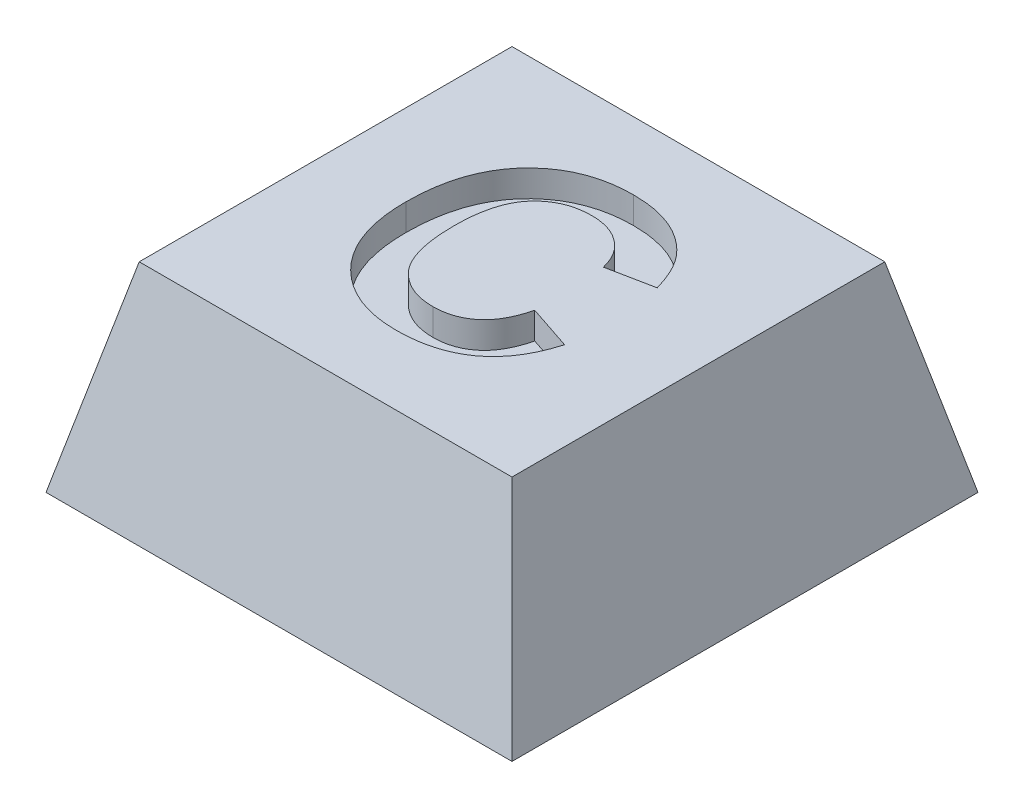
ISO-10303-21;
HEADER;
FILE_DESCRIPTION(('STEP AP214'),'2;1');
FILE_NAME('part.step','',(''),(''),'','','');
FILE_SCHEMA(('AUTOMOTIVE_DESIGN { 1 0 10303 214 1 1 1 1 }'));
ENDSEC;
DATA;
#1=APPLICATION_CONTEXT('core data for automotive mechanical design processes');
#2=APPLICATION_PROTOCOL_DEFINITION('international standard','automotive_design',2000,#1);
#3=PRODUCT_CONTEXT('',#1,'mechanical');
#4=PRODUCT('Part','Part','',(#3));
#5=PRODUCT_RELATED_PRODUCT_CATEGORY('part','',(#4));
#6=PRODUCT_DEFINITION_FORMATION('','',#4);
#7=PRODUCT_DEFINITION_CONTEXT('part definition',#1,'design');
#8=PRODUCT_DEFINITION('design','',#6,#7);
#9=PRODUCT_DEFINITION_SHAPE('','',#8);
#10=(LENGTH_UNIT() NAMED_UNIT(*) SI_UNIT(.MILLI.,.METRE.));
#11=(NAMED_UNIT(*) PLANE_ANGLE_UNIT() SI_UNIT($,.RADIAN.));
#12=(NAMED_UNIT(*) SI_UNIT($,.STERADIAN.) SOLID_ANGLE_UNIT());
#13=UNCERTAINTY_MEASURE_WITH_UNIT(LENGTH_MEASURE(1.E-05),#10,'distance_accuracy_value','');
#14=(GEOMETRIC_REPRESENTATION_CONTEXT(3) GLOBAL_UNCERTAINTY_ASSIGNED_CONTEXT((#13)) GLOBAL_UNIT_ASSIGNED_CONTEXT((#10,
#11,#12)) REPRESENTATION_CONTEXT('',''));
#15=CARTESIAN_POINT('',(0.,0.,0.));
#16=DIRECTION('',(0.,0.,1.));
#17=DIRECTION('',(1.,0.,0.));
#18=AXIS2_PLACEMENT_3D('',#15,#16,#17);
#19=CARTESIAN_POINT('',(0.,3.,0.));
#20=DIRECTION('',(0.,-1.,0.));
#21=DIRECTION('',(0.,0.,-1.));
#22=AXIS2_PLACEMENT_3D('',#19,#20,#21);
#23=PLANE('',#22);
#24=DIRECTION('',(-1.,0.,0.));
#25=VECTOR('',#24,1.);
#26=CARTESIAN_POINT('',(11.,3.,-0.7));
#27=LINE('',#26,#25);
#28=CARTESIAN_POINT('',(6.3,3.,-0.7));
#29=VERTEX_POINT('',#28);
#30=CARTESIAN_POINT('',(0.7,3.,-0.7));
#31=VERTEX_POINT('',#30);
#32=EDGE_CURVE('E65',#29,#31,#27,.T.);
#33=ORIENTED_EDGE('',*,*,#32,.F.);
#34=DIRECTION('',(0.,0.,1.));
#35=VECTOR('',#34,1.);
#36=CARTESIAN_POINT('',(6.3,3.,-7.));
#37=LINE('',#36,#35);
#38=CARTESIAN_POINT('',(6.3,3.,-6.3));
#39=VERTEX_POINT('',#38);
#40=EDGE_CURVE('E200',#39,#29,#37,.T.);
#41=ORIENTED_EDGE('',*,*,#40,.F.);
#42=DIRECTION('',(-1.,0.,0.));
#43=VECTOR('',#42,1.);
#44=CARTESIAN_POINT('',(11.,3.,-6.3));
#45=LINE('',#44,#43);
#46=CARTESIAN_POINT('',(0.699999999999998,3.,-6.3));
#47=VERTEX_POINT('',#46);
#48=EDGE_CURVE('E187',#39,#47,#45,.T.);
#49=ORIENTED_EDGE('',*,*,#48,.T.);
#50=DIRECTION('',(0.,0.,1.));
#51=VECTOR('',#50,1.);
#52=CARTESIAN_POINT('',(0.7,3.,-7.));
#53=LINE('',#52,#51);
#54=EDGE_CURVE('E201',#47,#31,#53,.T.);
#55=ORIENTED_EDGE('',*,*,#54,.T.);
#56=EDGE_LOOP('',(#33,#41,#49,#55));
#57=FACE_BOUND('',#56,.T.);
#58=CARTESIAN_POINT('',(3.49202919417469,3.,-2.32237478200368));
#59=CARTESIAN_POINT('',(3.51611680894592,3.,-2.32297572990987));
#60=CARTESIAN_POINT('',(3.56348152728715,3.,-2.32415740474918));
#61=CARTESIAN_POINT('',(3.63349023270817,3.,-2.33165740459681));
#62=CARTESIAN_POINT('',(3.7006843119823,3.,-2.34597007319835));
#63=CARTESIAN_POINT('',(3.7653926590744,3.,-2.36489598698485));
#64=CARTESIAN_POINT('',(3.82786668660298,3.,-2.38864242551098));
#65=CARTESIAN_POINT('',(3.88715346146772,3.,-2.41910433113053));
#66=CARTESIAN_POINT('',(3.94441942454572,3.,-2.45411576773062));
#67=CARTESIAN_POINT('',(3.99847635289725,3.,-2.49514648860273));
#68=CARTESIAN_POINT('',(4.05004809618444,3.,-2.54121130678809));
#69=CARTESIAN_POINT('',(4.09708458635847,3.,-2.59445075600599));
#70=CARTESIAN_POINT('',(4.14071483571103,3.,-2.65358561276894));
#71=CARTESIAN_POINT('',(4.1803853292997,3.,-2.71901107643952));
#72=CARTESIAN_POINT('',(4.21742158412729,3.,-2.79016712882709));
#73=CARTESIAN_POINT('',(4.24893221835754,3.,-2.86816241928443));
#74=CARTESIAN_POINT('',(4.2782871984308,3.,-2.95173650754942));
#75=CARTESIAN_POINT('',(4.29337860671829,3.,-3.01027874118026));
#76=CARTESIAN_POINT('',(4.30112374545674,3.,-3.0403234999524));
#77=B_SPLINE_CURVE_WITH_KNOTS('',3,(#58,#59,#60,#61,#62,#63,#64,#65,#66,#67,#68,#69,#70,#71,#72,
#73,#74,#75,#76),.UNSPECIFIED.,.F.,.F.,(4,1,1,1,1,1,1,1,1,1,1,1,1,1,1,1,4),(0.,
0.061261111030951,0.120460879867491,0.178740622720622,0.235724110774077,0.291792154435533,
0.348405626021554,0.404978529009326,0.462271107462339,0.520759570899294,0.580529380750155,
0.642578218137747,0.707405435716592,0.77492030077632,0.846330275241362,0.921134375567754,1.),.UNSPECIFIED.);
#78=CARTESIAN_POINT('',(3.49202919417469,3.,-2.32237478200368));
#79=VERTEX_POINT('',#78);
#80=CARTESIAN_POINT('',(4.30112374545674,3.,-3.0403234999524));
#81=VERTEX_POINT('',#80);
#82=EDGE_CURVE('E58',#79,#81,#77,.T.);
#83=ORIENTED_EDGE('',*,*,#82,.T.);
#84=DIRECTION('',(0.948683298050514,0.,0.316227766016838));
#85=VECTOR('',#84,1.);
#86=CARTESIAN_POINT('',(4.30112374545674,3.,-3.0403234999524));
#87=LINE('',#86,#85);
#88=CARTESIAN_POINT('',(4.97420066853367,3.,-2.81596452559342));
#89=VERTEX_POINT('',#88);
#90=EDGE_CURVE('E171',#81,#89,#87,.T.);
#91=ORIENTED_EDGE('',*,*,#90,.T.);
#92=CARTESIAN_POINT('',(4.97420066853367,3.,-2.81596452559342));
#93=CARTESIAN_POINT('',(4.96052167379467,3.,-2.77183256725306));
#94=CARTESIAN_POINT('',(4.93373389902689,3.,-2.68540831001492));
#95=CARTESIAN_POINT('',(4.88454705366547,3.,-2.56154182823337));
#96=CARTESIAN_POINT('',(4.82830265897915,3.,-2.44674911241438));
#97=CARTESIAN_POINT('',(4.76702338748191,3.,-2.33968659004377));
#98=CARTESIAN_POINT('',(4.69689840259219,3.,-2.24312003297682));
#99=CARTESIAN_POINT('',(4.62185367309214,3.,-2.15385218027148));
#100=CARTESIAN_POINT('',(4.53965781979006,3.,-2.07376318319285));
#101=CARTESIAN_POINT('',(4.45071641969911,3.,-2.00268202255746));
#102=CARTESIAN_POINT('',(4.35588558365264,3.,-1.93982340550905));
#103=CARTESIAN_POINT('',(4.25406375018434,3.,-1.88668332919111));
#104=CARTESIAN_POINT('',(4.14677046620917,3.,-1.84091515842684));
#105=CARTESIAN_POINT('',(4.03291771716647,3.,-1.80383329066162));
#106=CARTESIAN_POINT('',(3.91326110657738,3.,-1.77413634320027));
#107=CARTESIAN_POINT('',(3.78723919763197,3.,-1.75452134804609));
#108=CARTESIAN_POINT('',(3.6554415079085,3.,-1.74122173335712));
#109=CARTESIAN_POINT('',(3.56544815168326,3.,-1.73977973139058));
#110=CARTESIAN_POINT('',(3.51937294417469,3.,-1.73904144867035));
#111=B_SPLINE_CURVE_WITH_KNOTS('',3,(#92,#93,#94,#95,#96,#97,#98,#99,#100,#101,#102,#103,#104,
#105,#106,#107,#108,#109,#110),.UNSPECIFIED.,.F.,.F.,(4,1,1,1,1,1,1,1,1,1,1,1,1,1,1,1,4),(0.,
0.0704150419531534,0.137894802951166,0.202902915889941,0.265167571851971,0.325674736113894,
0.384566100128023,0.442763707684589,0.500294498194352,0.557901351941778,0.615910003955178,
0.675133413252053,0.735519841283144,0.798251590252311,0.8628542859845,0.929783514058984,1.),.UNSPECIFIED.);
#112=CARTESIAN_POINT('',(3.51937294417469,3.,-1.73904144867035));
#113=VERTEX_POINT('',#112);
#114=EDGE_CURVE('E566',#89,#113,#111,.T.);
#115=ORIENTED_EDGE('',*,*,#114,.T.);
#116=CARTESIAN_POINT('',(3.51937294417469,3.,-1.73904144867035));
#117=CARTESIAN_POINT('',(3.46250251547439,3.,-1.74021740578187));
#118=CARTESIAN_POINT('',(3.35063668164565,3.,-1.74253054858446));
#119=CARTESIAN_POINT('',(3.18704349515312,3.,-1.76581552485004));
#120=CARTESIAN_POINT('',(3.03114658558933,3.,-1.80214564045639));
#121=CARTESIAN_POINT('',(2.88272293242752,3.,-1.85244405346918));
#122=CARTESIAN_POINT('',(2.74276324276726,3.,-1.91906417379479));
#123=CARTESIAN_POINT('',(2.60999060760055,3.,-1.99926616204049));
#124=CARTESIAN_POINT('',(2.48537129811509,3.,-2.09467824861767));
#125=CARTESIAN_POINT('',(2.36934249963198,3.,-2.20369237218259));
#126=CARTESIAN_POINT('',(2.26392753085181,3.,-2.32547632822594));
#127=CARTESIAN_POINT('',(2.17277085363422,3.,-2.45937203113081));
#128=CARTESIAN_POINT('',(2.0948806251045,3.,-2.60349321521211));
#129=CARTESIAN_POINT('',(2.03192572641803,3.,-2.75852706760747));
#130=CARTESIAN_POINT('',(1.98269924385597,3.,-2.92431439526389));
#131=CARTESIAN_POINT('',(1.94821599072518,3.,-3.1006259707557));
#132=CARTESIAN_POINT('',(1.92663856366421,3.,-3.28751733236473));
#133=CARTESIAN_POINT('',(1.92418026441356,3.,-3.41559642067566));
#134=CARTESIAN_POINT('',(1.92291861725162,3.,-3.48132910892676));
#135=B_SPLINE_CURVE_WITH_KNOTS('',3,(#116,#117,#118,#119,#120,#121,#122,#123,#124,#125,#126,
#127,#128,#129,#130,#131,#132,#133,#134),.UNSPECIFIED.,.F.,.F.,(4,1,1,1,1,1,1,1,1,1,1,1,1,1,1,1,
4),(0.,0.0640655694681715,0.12601889087274,0.185824822435675,0.244304364347181,
0.302279210648544,0.36019597760611,0.418835489384929,0.478842389506342,0.539358251400318,
0.600002402667006,0.661054813797786,0.723669356261587,0.788261326541615,0.855679184967412,
0.925931740553533,1.),.UNSPECIFIED.);
#136=CARTESIAN_POINT('',(1.92291861725162,3.,-3.48132910892676));
#137=VERTEX_POINT('',#136);
#138=EDGE_CURVE('E561',#113,#137,#135,.T.);
#139=ORIENTED_EDGE('',*,*,#138,.T.);
#140=CARTESIAN_POINT('',(1.92291861725162,3.,-3.48132910892676));
#141=CARTESIAN_POINT('',(1.92417457762654,3.,-3.55056648538445));
#142=CARTESIAN_POINT('',(1.92662472715422,3.,-3.685635973731));
#143=CARTESIAN_POINT('',(1.94824257682245,3.,-3.88201544605772));
#144=CARTESIAN_POINT('',(1.98180300097432,3.,-4.06709165053107));
#145=CARTESIAN_POINT('',(2.03111268313543,3.,-4.23971704092617));
#146=CARTESIAN_POINT('',(2.09314244987708,3.,-4.40110649515643));
#147=CARTESIAN_POINT('',(2.17112724535143,3.,-4.54965791250847));
#148=CARTESIAN_POINT('',(2.26137463759631,3.,-4.68735188932803));
#149=CARTESIAN_POINT('',(2.36631118224364,3.,-4.81166466423526));
#150=CARTESIAN_POINT('',(2.48286876789756,3.,-4.92203759854897));
#151=CARTESIAN_POINT('',(2.60777463717314,3.,-5.01963711149734));
#152=CARTESIAN_POINT('',(2.74219404974488,3.,-5.10151610526197));
#153=CARTESIAN_POINT('',(2.88539143233108,3.,-5.16847246196603));
#154=CARTESIAN_POINT('',(3.03755883773458,3.,-5.22028658602278));
#155=CARTESIAN_POINT('',(3.19839684202891,3.,-5.25759682223829));
#156=CARTESIAN_POINT('',(3.36803703916994,3.,-5.27931377889491));
#157=CARTESIAN_POINT('',(3.48402088375698,3.,-5.28235911354874));
#158=CARTESIAN_POINT('',(3.54321108520033,3.,-5.28391324354214));
#159=B_SPLINE_CURVE_WITH_KNOTS('',3,(#140,#141,#142,#143,#144,#145,#146,#147,#148,#149,#150,
#151,#152,#153,#154,#155,#156,#157,#158),.UNSPECIFIED.,.F.,.F.,(4,1,1,1,1,1,1,1,1,1,1,1,1,1,1,1,
4),(0.,0.0757905194890958,0.147853474707659,0.216062561283916,0.281513739182418,
0.344147286720871,0.405039848029214,0.464871931062684,0.524079072848527,0.582724996832957,
0.640361728319916,0.697328760762678,0.754684166326505,0.813113060604922,0.873014604238728,
0.935195361196756,1.),.UNSPECIFIED.);
#160=CARTESIAN_POINT('',(3.54321108520033,3.,-5.28391324354214));
#161=VERTEX_POINT('',#160);
#162=EDGE_CURVE('E555',#137,#161,#159,.T.);
#163=ORIENTED_EDGE('',*,*,#162,.T.);
#164=CARTESIAN_POINT('',(3.54321108520033,3.,-5.28391324354214));
#165=CARTESIAN_POINT('',(3.59490417540688,3.,-5.2826107117257));
#166=CARTESIAN_POINT('',(3.69625535798317,3.,-5.28005692476091));
#167=CARTESIAN_POINT('',(3.84467387317335,3.,-5.26270640216942));
#168=CARTESIAN_POINT('',(3.98533309032242,3.,-5.23225739328103));
#169=CARTESIAN_POINT('',(4.11899331821896,3.,-5.19115800227554));
#170=CARTESIAN_POINT('',(4.24489368934686,3.,-5.13691773942573));
#171=CARTESIAN_POINT('',(4.36325975372196,3.,-5.07063669671643));
#172=CARTESIAN_POINT('',(4.47449836414569,3.,-4.99266556909028));
#173=CARTESIAN_POINT('',(4.54152191703653,3.,-4.93176088349919));
#174=CARTESIAN_POINT('',(4.57526236725161,3.,-4.90110074354214));
#175=B_SPLINE_CURVE_WITH_KNOTS('',3,(#164,#165,#166,#167,#168,#169,#170,#171,#172,#173,#174),
.UNSPECIFIED.,.F.,.F.,(4,1,1,1,1,1,1,1,4),(0.,0.137313759544352,0.269221899062523,
0.396222126499405,0.519140291574912,0.640111565704798,0.759624432420136,0.878992092763873,1.),.UNSPECIFIED.);
#176=CARTESIAN_POINT('',(4.57526236725161,3.,-4.90110074354214));
#177=VERTEX_POINT('',#176);
#178=EDGE_CURVE('E545',#161,#177,#175,.T.);
#179=ORIENTED_EDGE('',*,*,#178,.T.);
#180=CARTESIAN_POINT('',(4.57526236725161,3.,-4.90110074354214));
#181=CARTESIAN_POINT('',(4.59481788925671,3.,-4.8815913851209));
#182=CARTESIAN_POINT('',(4.63438827823294,3.,-4.84211440766134));
#183=CARTESIAN_POINT('',(4.68722585412791,3.,-4.7754660839842));
#184=CARTESIAN_POINT('',(4.73732244021412,3.,-4.70371915221836));
#185=CARTESIAN_POINT('',(4.78388290376538,3.,-4.6256497012682));
#186=CARTESIAN_POINT('',(4.82543567252316,3.,-4.54066776004728));
#187=CARTESIAN_POINT('',(4.86398030383741,3.,-4.45007838047809));
#188=CARTESIAN_POINT('',(4.89946689980702,3.,-4.35353237125029));
#189=CARTESIAN_POINT('',(4.91920152793077,3.,-4.28634231417154));
#190=CARTESIAN_POINT('',(4.92932887366187,3.,-4.25186196149086));
#191=B_SPLINE_CURVE_WITH_KNOTS('',3,(#180,#181,#182,#183,#184,#185,#186,#187,#188,#189,#190),
.UNSPECIFIED.,.F.,.F.,(4,1,1,1,1,1,1,1,4),(0.,0.110661610139293,0.223922580885613,
0.340367194498051,0.461366927555407,0.587913320172306,0.719309719765118,0.855956367990685,1.),.UNSPECIFIED.);
#192=CARTESIAN_POINT('',(4.92932887366187,3.,-4.25186196149086));
#193=VERTEX_POINT('',#192);
#194=EDGE_CURVE('E554',#177,#193,#191,.T.);
#195=ORIENTED_EDGE('',*,*,#194,.T.);
#196=DIRECTION('',(-0.98058067569092,0.,0.196116135138183));
#197=VECTOR('',#196,1.);
#198=CARTESIAN_POINT('',(4.92932887366187,3.,-4.25186196149086));
#199=LINE('',#198,#197);
#200=CARTESIAN_POINT('',(4.25625195058495,3.,-4.11724657687547));
#201=VERTEX_POINT('',#200);
#202=EDGE_CURVE('E586',#193,#201,#199,.T.);
#203=ORIENTED_EDGE('',*,*,#202,.T.);
#204=CARTESIAN_POINT('',(4.25625195058495,3.,-4.11724657687547));
#205=CARTESIAN_POINT('',(4.25053107342916,3.,-4.13932353897863));
#206=CARTESIAN_POINT('',(4.23926244637778,3.,-4.18280936214759));
#207=CARTESIAN_POINT('',(4.21646191291949,3.,-4.24529610194437));
#208=CARTESIAN_POINT('',(4.19030790333489,3.,-4.30459043729654));
#209=CARTESIAN_POINT('',(4.15789240369965,3.,-4.35924004286793));
#210=CARTESIAN_POINT('',(4.12345876092659,3.,-4.41167612567644));
#211=CARTESIAN_POINT('',(4.08269127072711,3.,-4.45957036106955));
#212=CARTESIAN_POINT('',(4.0381934888391,3.,-4.5041779517257));
#213=CARTESIAN_POINT('',(3.98964485982005,3.,-4.54503597940394));
#214=CARTESIAN_POINT('',(3.93762415292998,3.,-4.58131884439474));
#215=CARTESIAN_POINT('',(3.88313295143614,3.,-4.61393488024746));
#216=CARTESIAN_POINT('',(3.82518085531721,3.,-4.64055975710396));
#217=CARTESIAN_POINT('',(3.76453876999298,3.,-4.66209922011643));
#218=CARTESIAN_POINT('',(3.70144822792528,3.,-4.68015843697106));
#219=CARTESIAN_POINT('',(3.63534752992293,3.,-4.69131445679152));
#220=CARTESIAN_POINT('',(3.56680440330837,3.,-4.69987867471469));
#221=CARTESIAN_POINT('',(3.52010354280225,3.,-4.70034273886559));
#222=CARTESIAN_POINT('',(3.49623592494392,3.,-4.70057991020881));
#223=B_SPLINE_CURVE_WITH_KNOTS('',3,(#204,#205,#206,#207,#208,#209,#210,#211,#212,#213,#214,
#215,#216,#217,#218,#219,#220,#221,#222),.UNSPECIFIED.,.F.,.F.,(4,1,1,1,1,1,1,1,1,1,1,1,1,1,1,1,
4),(0.,0.0657016834287565,0.129415078675093,0.191523435490404,0.252186483377304,
0.312349991115616,0.372123768561351,0.433096485607346,0.493819351625764,0.55474739455387,
0.615749876169393,0.676633212199273,0.738216912125845,0.801141922285418,0.865493176101047,
0.931256995323742,1.),.UNSPECIFIED.);
#224=CARTESIAN_POINT('',(3.49623592494392,3.,-4.70057991020881));
#225=VERTEX_POINT('',#224);
#226=EDGE_CURVE('E593',#201,#225,#223,.T.);
#227=ORIENTED_EDGE('',*,*,#226,.T.);
#228=CARTESIAN_POINT('',(3.49623592494392,3.,-4.70057991020881));
#229=CARTESIAN_POINT('',(3.46345817805145,3.,-4.69991794910472));
#230=CARTESIAN_POINT('',(3.39948582403322,3.,-4.69862599910474));
#231=CARTESIAN_POINT('',(3.30598042709671,3.,-4.68422163133387));
#232=CARTESIAN_POINT('',(3.21685915654472,3.,-4.66411884560106));
#233=CARTESIAN_POINT('',(3.13248143292658,3.,-4.63342199574539));
#234=CARTESIAN_POINT('',(3.05336978614843,3.,-4.59416097854338));
#235=CARTESIAN_POINT('',(2.97862510712283,3.,-4.54643482208268));
#236=CARTESIAN_POINT('',(2.90865763474271,3.,-4.49044794874512));
#237=CARTESIAN_POINT('',(2.84344372117106,3.,-4.42553709878164));
#238=CARTESIAN_POINT('',(2.78492309776695,3.,-4.35052865192286));
#239=CARTESIAN_POINT('',(2.73347511661476,3.,-4.26526774257099));
#240=CARTESIAN_POINT('',(2.69079440440862,3.,-4.16878638415222));
#241=CARTESIAN_POINT('',(2.65614445357166,3.,-4.06203136151986));
#242=CARTESIAN_POINT('',(2.62887099480884,3.,-3.94474881100223));
#243=CARTESIAN_POINT('',(2.60939559812234,3.,-3.81678831048973));
#244=CARTESIAN_POINT('',(2.59862511827261,3.,-3.67806232313208));
#245=CARTESIAN_POINT('',(2.59689098050791,3.,-3.5820750386337));
#246=CARTESIAN_POINT('',(2.59599554032854,3.,-3.5325109999524));
#247=B_SPLINE_CURVE_WITH_KNOTS('',3,(#228,#229,#230,#231,#232,#233,#234,#235,#236,#237,#238,
#239,#240,#241,#242,#243,#244,#245,#246),.UNSPECIFIED.,.F.,.F.,(4,1,1,1,1,1,1,1,1,1,1,1,1,1,1,1,
4),(0.,0.0586371378579327,0.114442147410832,0.169048205254452,0.221995273549603,
0.274768432180556,0.326888880850664,0.380476958263482,0.434920839410136,0.491256742374203,
0.550390473800242,0.612762371738895,0.679720015327365,0.751074463246395,0.828128844834478,
0.911252530714446,1.),.UNSPECIFIED.);
#248=CARTESIAN_POINT('',(2.59599554032854,3.,-3.5325109999524));
#249=VERTEX_POINT('',#248);
#250=EDGE_CURVE('E599',#225,#249,#247,.T.);
#251=ORIENTED_EDGE('',*,*,#250,.T.);
#252=CARTESIAN_POINT('',(2.59599554032854,3.,-3.5325109999524));
#253=CARTESIAN_POINT('',(2.5968821633552,3.,-3.47990985233911));
#254=CARTESIAN_POINT('',(2.59859054935794,3.,-3.37855554322628));
#255=CARTESIAN_POINT('',(2.6093587440414,3.,-3.23236132670273));
#256=CARTESIAN_POINT('',(2.62895867696155,3.,-3.09790132268989));
#257=CARTESIAN_POINT('',(2.65586967207876,3.,-2.97493691219596));
#258=CARTESIAN_POINT('',(2.69069423660056,3.,-2.86354341182001));
#259=CARTESIAN_POINT('',(2.73330277130993,3.,-2.76391358663968));
#260=CARTESIAN_POINT('',(2.78395618785242,3.,-2.6759307584889));
#261=CARTESIAN_POINT('',(2.84257567981989,3.,-2.59965351358793));
#262=CARTESIAN_POINT('',(2.90767924627187,3.,-2.53413159547325));
#263=CARTESIAN_POINT('',(2.97750360637937,3.,-2.47779766373055));
#264=CARTESIAN_POINT('',(3.05163681041787,3.,-2.42963237427566));
#265=CARTESIAN_POINT('',(3.13052495908561,3.,-2.39000507963076));
#266=CARTESIAN_POINT('',(3.21446810036846,3.,-2.36002747214086));
#267=CARTESIAN_POINT('',(3.30277634539132,3.,-2.338287185638));
#268=CARTESIAN_POINT('',(3.39577371173474,3.,-2.32446654004919));
#269=CARTESIAN_POINT('',(3.45949434596355,3.,-2.32308180698325));
#270=CARTESIAN_POINT('',(3.49202919417469,3.,-2.32237478200368));
#271=B_SPLINE_CURVE_WITH_KNOTS('',3,(#252,#253,#254,#255,#256,#257,#258,#259,#260,#261,#262,
#263,#264,#265,#266,#267,#268,#269,#270),.UNSPECIFIED.,.F.,.F.,(4,1,1,1,1,1,1,1,1,1,1,1,1,1,1,1,
4),(0.,0.0922005232498242,0.177656206334666,0.256732639089643,0.33017725718312,
0.398062973022245,0.460994882558931,0.519731382248013,0.575527448203976,0.629114465177631,
0.681254031878146,0.732497651874267,0.783792002469296,0.83562331093939,0.888378761586058,
0.943007785580155,1.),.UNSPECIFIED.);
#272=EDGE_CURVE('E167',#249,#79,#271,.T.);
#273=ORIENTED_EDGE('',*,*,#272,.T.);
#274=EDGE_LOOP('',(#83,#91,#115,#139,#163,#179,#195,#203,#227,#251,#273));
#275=FACE_BOUND('',#274,.T.);
#276=ADVANCED_FACE('F42',(#57,#275),#23,.F.);
#277=CARTESIAN_POINT('',(7.,0.,-7.));
#278=DIRECTION('',(-0.973841209741793,-0.227229615606418,0.));
#279=DIRECTION('',(0.227229615606418,-0.973841209741793,0.));
#280=AXIS2_PLACEMENT_3D('',#277,#278,#279);
#281=PLANE('',#280);
#282=DIRECTION('',(-0.221581128241521,0.949633406749377,-0.221581128241521));
#283=VECTOR('',#282,1.);
#284=CARTESIAN_POINT('',(6.6563126252505,1.47294589178357,-0.343687374749499));
#285=LINE('',#284,#283);
#286=CARTESIAN_POINT('',(7.,0.,0.));
#287=VERTEX_POINT('',#286);
#288=EDGE_CURVE('E197',#287,#29,#285,.T.);
#289=ORIENTED_EDGE('',*,*,#288,.F.);
#290=DIRECTION('',(0.,0.,-1.));
#291=VECTOR('',#290,1.);
#292=CARTESIAN_POINT('',(7.,0.,0.));
#293=LINE('',#292,#291);
#294=CARTESIAN_POINT('',(7.,0.,-7.));
#295=VERTEX_POINT('',#294);
#296=EDGE_CURVE('E215',#287,#295,#293,.T.);
#297=ORIENTED_EDGE('',*,*,#296,.T.);
#298=DIRECTION('',(0.221581128241521,-0.949633406749377,-0.221581128241521));
#299=VECTOR('',#298,1.);
#300=CARTESIAN_POINT('',(7.,0.,-7.));
#301=LINE('',#300,#299);
#302=EDGE_CURVE('E191',#39,#295,#301,.T.);
#303=ORIENTED_EDGE('',*,*,#302,.F.);
#304=ORIENTED_EDGE('',*,*,#40,.T.);
#305=EDGE_LOOP('',(#289,#297,#303,#304));
#306=FACE_BOUND('',#305,.T.);
#307=ADVANCED_FACE('F240',(#306),#281,.F.);
#308=CARTESIAN_POINT('',(0.,0.,-7.));
#309=DIRECTION('',(0.973841209741793,-0.227229615606418,0.));
#310=DIRECTION('',(0.227229615606418,0.973841209741793,0.));
#311=AXIS2_PLACEMENT_3D('',#308,#309,#310);
#312=PLANE('',#311);
#313=DIRECTION('',(-0.221581128241521,-0.949633406749378,0.221581128241521));
#314=VECTOR('',#313,1.);
#315=CARTESIAN_POINT('',(0.343687374749499,1.47294589178357,-0.3436873747495));
#316=LINE('',#315,#314);
#317=CARTESIAN_POINT('',(0.,0.,0.));
#318=VERTEX_POINT('',#317);
#319=EDGE_CURVE('E11',#31,#318,#316,.T.);
#320=ORIENTED_EDGE('',*,*,#319,.F.);
#321=ORIENTED_EDGE('',*,*,#54,.F.);
#322=DIRECTION('',(0.221581128241521,0.949633406749377,0.221581128241521));
#323=VECTOR('',#322,1.);
#324=CARTESIAN_POINT('',(0.,0.,-7.));
#325=LINE('',#324,#323);
#326=CARTESIAN_POINT('',(0.,0.,-7.));
#327=VERTEX_POINT('',#326);
#328=EDGE_CURVE('E51',#327,#47,#325,.T.);
#329=ORIENTED_EDGE('',*,*,#328,.F.);
#330=DIRECTION('',(0.,0.,1.));
#331=VECTOR('',#330,1.);
#332=CARTESIAN_POINT('',(0.,0.,0.));
#333=LINE('',#332,#331);
#334=EDGE_CURVE('E205',#327,#318,#333,.T.);
#335=ORIENTED_EDGE('',*,*,#334,.T.);
#336=EDGE_LOOP('',(#320,#321,#329,#335));
#337=FACE_BOUND('',#336,.T.);
#338=ADVANCED_FACE('F233',(#337),#312,.F.);
#339=CARTESIAN_POINT('',(0.,0.,0.));
#340=DIRECTION('',(0.,-1.,0.));
#341=DIRECTION('',(0.,0.,-1.));
#342=AXIS2_PLACEMENT_3D('',#339,#340,#341);
#343=PLANE('',#342);
#344=CARTESIAN_POINT('',(3.5,0.,-3.5));
#345=DIRECTION('',(0.,-1.,0.));
#346=DIRECTION('',(0.,0.,-1.));
#347=AXIS2_PLACEMENT_3D('',#344,#345,#346);
#348=CIRCLE('',#347,1.8);
#349=CARTESIAN_POINT('',(3.5,0.,-5.3));
#350=VERTEX_POINT('',#349);
#351=EDGE_CURVE('E173',#350,#350,#348,.T.);
#352=ORIENTED_EDGE('',*,*,#351,.F.);
#353=EDGE_LOOP('',(#352));
#354=FACE_BOUND('',#353,.T.);
#355=ORIENTED_EDGE('',*,*,#334,.F.);
#356=DIRECTION('',(-1.,0.,0.));
#357=VECTOR('',#356,1.);
#358=CARTESIAN_POINT('',(0.,0.,-7.));
#359=LINE('',#358,#357);
#360=EDGE_CURVE('E219',#295,#327,#359,.T.);
#361=ORIENTED_EDGE('',*,*,#360,.F.);
#362=ORIENTED_EDGE('',*,*,#296,.F.);
#363=DIRECTION('',(1.,0.,0.));
#364=VECTOR('',#363,1.);
#365=CARTESIAN_POINT('',(0.,0.,0.));
#366=LINE('',#365,#364);
#367=EDGE_CURVE('E212',#318,#287,#366,.T.);
#368=ORIENTED_EDGE('',*,*,#367,.F.);
#369=EDGE_LOOP('',(#355,#361,#362,#368));
#370=FACE_BOUND('',#369,.T.);
#371=ADVANCED_FACE('F44',(#354,#370),#343,.T.);
#372=CARTESIAN_POINT('',(11.,3.,-6.3));
#373=DIRECTION('',(0.,0.227229615606418,-0.973841209741793));
#374=DIRECTION('',(0.,0.973841209741793,0.227229615606418));
#375=AXIS2_PLACEMENT_3D('',#372,#373,#374);
#376=PLANE('',#375);
#377=ORIENTED_EDGE('',*,*,#302,.T.);
#378=ORIENTED_EDGE('',*,*,#360,.T.);
#379=ORIENTED_EDGE('',*,*,#328,.T.);
#380=ORIENTED_EDGE('',*,*,#48,.F.);
#381=EDGE_LOOP('',(#377,#378,#379,#380));
#382=FACE_BOUND('',#381,.T.);
#383=ADVANCED_FACE('F224',(#382),#376,.T.);
#384=CARTESIAN_POINT('',(11.,0.,0.));
#385=DIRECTION('',(0.,0.227229615606418,0.973841209741793));
#386=DIRECTION('',(0.,-0.973841209741793,0.227229615606418));
#387=AXIS2_PLACEMENT_3D('',#384,#385,#386);
#388=PLANE('',#387);
#389=ORIENTED_EDGE('',*,*,#288,.T.);
#390=ORIENTED_EDGE('',*,*,#32,.T.);
#391=ORIENTED_EDGE('',*,*,#319,.T.);
#392=ORIENTED_EDGE('',*,*,#367,.T.);
#393=EDGE_LOOP('',(#389,#390,#391,#392));
#394=FACE_BOUND('',#393,.T.);
#395=ADVANCED_FACE('F235',(#394),#388,.T.);
#396=CARTESIAN_POINT('',(3.5,0.8,-3.5));
#397=DIRECTION('',(0.,-1.,0.));
#398=DIRECTION('',(0.,0.,-1.));
#399=AXIS2_PLACEMENT_3D('',#396,#397,#398);
#400=CYLINDRICAL_SURFACE('',#399,1.8);
#401=CARTESIAN_POINT('',(3.5,0.8,-3.5));
#402=DIRECTION('',(0.,-1.,0.));
#403=DIRECTION('',(0.,0.,-1.));
#404=AXIS2_PLACEMENT_3D('',#401,#402,#403);
#405=CIRCLE('',#404,1.8);
#406=CARTESIAN_POINT('',(3.5,0.8,-5.3));
#407=VERTEX_POINT('',#406);
#408=EDGE_CURVE('E179',#407,#407,#405,.T.);
#409=ORIENTED_EDGE('',*,*,#408,.F.);
#410=EDGE_LOOP('',(#409));
#411=FACE_BOUND('',#410,.T.);
#412=ORIENTED_EDGE('',*,*,#351,.T.);
#413=EDGE_LOOP('',(#412));
#414=FACE_BOUND('',#413,.T.);
#415=ADVANCED_FACE('F260',(#411,#414),#400,.F.);
#416=CARTESIAN_POINT('',(3.5,0.8,-3.5));
#417=DIRECTION('',(0.,-1.,0.));
#418=DIRECTION('',(0.,0.,-1.));
#419=AXIS2_PLACEMENT_3D('',#416,#417,#418);
#420=PLANE('',#419);
#421=ORIENTED_EDGE('',*,*,#408,.T.);
#422=EDGE_LOOP('',(#421));
#423=FACE_BOUND('',#422,.T.);
#424=ADVANCED_FACE('F263',(#423),#420,.T.);
#425=CARTESIAN_POINT('',(3.49202919417469,2.6,-2.32237478200368));
#426=CARTESIAN_POINT('',(3.51611680894592,2.6,-2.32297572990987));
#427=CARTESIAN_POINT('',(3.56348152728715,2.6,-2.32415740474918));
#428=CARTESIAN_POINT('',(3.63349023270817,2.6,-2.33165740459681));
#429=CARTESIAN_POINT('',(3.7006843119823,2.6,-2.34597007319835));
#430=CARTESIAN_POINT('',(3.7653926590744,2.6,-2.36489598698485));
#431=CARTESIAN_POINT('',(3.82786668660298,2.6,-2.38864242551098));
#432=CARTESIAN_POINT('',(3.88715346146772,2.6,-2.41910433113053));
#433=CARTESIAN_POINT('',(3.94441942454572,2.6,-2.45411576773062));
#434=CARTESIAN_POINT('',(3.99847635289725,2.6,-2.49514648860273));
#435=CARTESIAN_POINT('',(4.05004809618444,2.6,-2.54121130678809));
#436=CARTESIAN_POINT('',(4.09708458635847,2.6,-2.59445075600599));
#437=CARTESIAN_POINT('',(4.14071483571103,2.6,-2.65358561276894));
#438=CARTESIAN_POINT('',(4.1803853292997,2.6,-2.71901107643952));
#439=CARTESIAN_POINT('',(4.21742158412729,2.6,-2.79016712882709));
#440=CARTESIAN_POINT('',(4.24893221835754,2.6,-2.86816241928443));
#441=CARTESIAN_POINT('',(4.2782871984308,2.6,-2.95173650754942));
#442=CARTESIAN_POINT('',(4.29337860671829,2.6,-3.01027874118026));
#443=CARTESIAN_POINT('',(4.30112374545674,2.6,-3.0403234999524));
#444=B_SPLINE_CURVE_WITH_KNOTS('',3,(#425,#426,#427,#428,#429,#430,#431,#432,#433,#434,#435,
#436,#437,#438,#439,#440,#441,#442,#443),.UNSPECIFIED.,.F.,.F.,(4,1,1,1,1,1,1,1,1,1,1,1,1,1,1,1,
4),(0.,0.061261111030951,0.120460879867491,0.178740622720622,0.235724110774077,
0.291792154435533,0.348405626021554,0.404978529009326,0.462271107462339,0.520759570899294,
0.580529380750155,0.642578218137747,0.707405435716592,0.77492030077632,0.846330275241362,
0.921134375567754,1.),.UNSPECIFIED.);
#445=DIRECTION('',(0.,1.,0.));
#446=VECTOR('',#445,1.);
#447=SURFACE_OF_LINEAR_EXTRUSION('',#444,#446);
#448=ORIENTED_EDGE('',*,*,#82,.F.);
#449=DIRECTION('',(0.,1.,0.));
#450=VECTOR('',#449,1.);
#451=CARTESIAN_POINT('',(3.49202919417469,2.6,-2.32237478200368));
#452=LINE('',#451,#450);
#453=CARTESIAN_POINT('',(3.49202919417469,2.6,-2.32237478200368));
#454=VERTEX_POINT('',#453);
#455=EDGE_CURVE('E165',#454,#79,#452,.T.);
#456=ORIENTED_EDGE('',*,*,#455,.F.);
#457=CARTESIAN_POINT('',(4.30112374545674,2.6,-3.0403234999524));
#458=VERTEX_POINT('',#457);
#459=EDGE_CURVE('E155',#454,#458,#444,.T.);
#460=ORIENTED_EDGE('',*,*,#459,.T.);
#461=DIRECTION('',(0.,1.,0.));
#462=VECTOR('',#461,1.);
#463=CARTESIAN_POINT('',(4.30112374545674,2.6,-3.0403234999524));
#464=LINE('',#463,#462);
#465=EDGE_CURVE('E164',#458,#81,#464,.T.);
#466=ORIENTED_EDGE('',*,*,#465,.T.);
#467=EDGE_LOOP('',(#448,#456,#460,#466));
#468=FACE_BOUND('',#467,.T.);
#469=ADVANCED_FACE('F163',(#468),#447,.T.);
#470=CARTESIAN_POINT('',(4.30112374545674,2.6,-3.0403234999524));
#471=DIRECTION('',(-0.316227766016838,0.,0.948683298050514));
#472=DIRECTION('',(0.948683298050514,0.,0.316227766016838));
#473=AXIS2_PLACEMENT_3D('',#470,#471,#472);
#474=PLANE('',#473);
#475=ORIENTED_EDGE('',*,*,#90,.F.);
#476=ORIENTED_EDGE('',*,*,#465,.F.);
#477=DIRECTION('',(0.948683298050514,0.,0.316227766016838));
#478=VECTOR('',#477,1.);
#479=CARTESIAN_POINT('',(4.30112374545674,2.6,-3.0403234999524));
#480=LINE('',#479,#478);
#481=CARTESIAN_POINT('',(4.97420066853367,2.6,-2.81596452559342));
#482=VERTEX_POINT('',#481);
#483=EDGE_CURVE('E151',#458,#482,#480,.T.);
#484=ORIENTED_EDGE('',*,*,#483,.T.);
#485=DIRECTION('',(0.,1.,0.));
#486=VECTOR('',#485,1.);
#487=CARTESIAN_POINT('',(4.97420066853367,2.6,-2.81596452559342));
#488=LINE('',#487,#486);
#489=EDGE_CURVE('E174',#482,#89,#488,.T.);
#490=ORIENTED_EDGE('',*,*,#489,.T.);
#491=EDGE_LOOP('',(#475,#476,#484,#490));
#492=FACE_BOUND('',#491,.T.);
#493=ADVANCED_FACE('F169',(#492),#474,.T.);
#494=CARTESIAN_POINT('',(4.97420066853367,2.6,-2.81596452559342));
#495=CARTESIAN_POINT('',(4.96052167379467,2.6,-2.77183256725306));
#496=CARTESIAN_POINT('',(4.93373389902689,2.6,-2.68540831001492));
#497=CARTESIAN_POINT('',(4.88454705366547,2.6,-2.56154182823337));
#498=CARTESIAN_POINT('',(4.82830265897915,2.6,-2.44674911241438));
#499=CARTESIAN_POINT('',(4.76702338748191,2.6,-2.33968659004377));
#500=CARTESIAN_POINT('',(4.69689840259219,2.6,-2.24312003297682));
#501=CARTESIAN_POINT('',(4.62185367309214,2.6,-2.15385218027148));
#502=CARTESIAN_POINT('',(4.53965781979006,2.6,-2.07376318319285));
#503=CARTESIAN_POINT('',(4.45071641969911,2.6,-2.00268202255746));
#504=CARTESIAN_POINT('',(4.35588558365264,2.6,-1.93982340550905));
#505=CARTESIAN_POINT('',(4.25406375018434,2.6,-1.88668332919111));
#506=CARTESIAN_POINT('',(4.14677046620917,2.6,-1.84091515842684));
#507=CARTESIAN_POINT('',(4.03291771716647,2.6,-1.80383329066162));
#508=CARTESIAN_POINT('',(3.91326110657738,2.6,-1.77413634320027));
#509=CARTESIAN_POINT('',(3.78723919763197,2.6,-1.75452134804609));
#510=CARTESIAN_POINT('',(3.6554415079085,2.6,-1.74122173335712));
#511=CARTESIAN_POINT('',(3.56544815168326,2.6,-1.73977973139058));
#512=CARTESIAN_POINT('',(3.51937294417469,2.6,-1.73904144867035));
#513=B_SPLINE_CURVE_WITH_KNOTS('',3,(#494,#495,#496,#497,#498,#499,#500,#501,#502,#503,#504,
#505,#506,#507,#508,#509,#510,#511,#512),.UNSPECIFIED.,.F.,.F.,(4,1,1,1,1,1,1,1,1,1,1,1,1,1,1,1,
4),(0.,0.0704150419531534,0.137894802951166,0.202902915889941,0.265167571851971,
0.325674736113894,0.384566100128023,0.442763707684589,0.500294498194352,0.557901351941778,
0.615910003955178,0.675133413252053,0.735519841283144,0.798251590252311,0.8628542859845,
0.929783514058984,1.),.UNSPECIFIED.);
#514=DIRECTION('',(0.,1.,0.));
#515=VECTOR('',#514,1.);
#516=SURFACE_OF_LINEAR_EXTRUSION('',#513,#515);
#517=ORIENTED_EDGE('',*,*,#114,.F.);
#518=ORIENTED_EDGE('',*,*,#489,.F.);
#519=CARTESIAN_POINT('',(3.51937294417469,2.6,-1.73904144867035));
#520=VERTEX_POINT('',#519);
#521=EDGE_CURVE('E157',#482,#520,#513,.T.);
#522=ORIENTED_EDGE('',*,*,#521,.T.);
#523=DIRECTION('',(0.,1.,0.));
#524=VECTOR('',#523,1.);
#525=CARTESIAN_POINT('',(3.51937294417469,2.6,-1.73904144867035));
#526=LINE('',#525,#524);
#527=EDGE_CURVE('E181',#520,#113,#526,.T.);
#528=ORIENTED_EDGE('',*,*,#527,.T.);
#529=EDGE_LOOP('',(#517,#518,#522,#528));
#530=FACE_BOUND('',#529,.T.);
#531=ADVANCED_FACE('F291',(#530),#516,.T.);
#532=CARTESIAN_POINT('',(3.51937294417469,2.6,-1.73904144867035));
#533=CARTESIAN_POINT('',(3.46250251547439,2.6,-1.74021740578187));
#534=CARTESIAN_POINT('',(3.35063668164565,2.6,-1.74253054858446));
#535=CARTESIAN_POINT('',(3.18704349515312,2.6,-1.76581552485004));
#536=CARTESIAN_POINT('',(3.03114658558933,2.6,-1.80214564045639));
#537=CARTESIAN_POINT('',(2.88272293242752,2.6,-1.85244405346918));
#538=CARTESIAN_POINT('',(2.74276324276726,2.6,-1.91906417379479));
#539=CARTESIAN_POINT('',(2.60999060760055,2.6,-1.99926616204049));
#540=CARTESIAN_POINT('',(2.48537129811509,2.6,-2.09467824861767));
#541=CARTESIAN_POINT('',(2.36934249963198,2.6,-2.20369237218259));
#542=CARTESIAN_POINT('',(2.26392753085181,2.6,-2.32547632822594));
#543=CARTESIAN_POINT('',(2.17277085363422,2.6,-2.45937203113081));
#544=CARTESIAN_POINT('',(2.0948806251045,2.6,-2.60349321521211));
#545=CARTESIAN_POINT('',(2.03192572641803,2.6,-2.75852706760747));
#546=CARTESIAN_POINT('',(1.98269924385597,2.6,-2.92431439526389));
#547=CARTESIAN_POINT('',(1.94821599072518,2.6,-3.1006259707557));
#548=CARTESIAN_POINT('',(1.92663856366421,2.6,-3.28751733236473));
#549=CARTESIAN_POINT('',(1.92418026441356,2.6,-3.41559642067566));
#550=CARTESIAN_POINT('',(1.92291861725162,2.6,-3.48132910892676));
#551=B_SPLINE_CURVE_WITH_KNOTS('',3,(#532,#533,#534,#535,#536,#537,#538,#539,#540,#541,#542,
#543,#544,#545,#546,#547,#548,#549,#550),.UNSPECIFIED.,.F.,.F.,(4,1,1,1,1,1,1,1,1,1,1,1,1,1,1,1,
4),(0.,0.0640655694681715,0.12601889087274,0.185824822435675,0.244304364347181,
0.302279210648544,0.36019597760611,0.418835489384929,0.478842389506342,0.539358251400318,
0.600002402667006,0.661054813797786,0.723669356261587,0.788261326541615,0.855679184967412,
0.925931740553533,1.),.UNSPECIFIED.);
#552=DIRECTION('',(0.,1.,0.));
#553=VECTOR('',#552,1.);
#554=SURFACE_OF_LINEAR_EXTRUSION('',#551,#553);
#555=ORIENTED_EDGE('',*,*,#138,.F.);
#556=ORIENTED_EDGE('',*,*,#527,.F.);
#557=CARTESIAN_POINT('',(1.92291861725162,2.6,-3.48132910892676));
#558=VERTEX_POINT('',#557);
#559=EDGE_CURVE('E283',#520,#558,#551,.T.);
#560=ORIENTED_EDGE('',*,*,#559,.T.);
#561=DIRECTION('',(0.,1.,0.));
#562=VECTOR('',#561,1.);
#563=CARTESIAN_POINT('',(1.92291861725162,2.6,-3.48132910892676));
#564=LINE('',#563,#562);
#565=EDGE_CURVE('E637',#558,#137,#564,.T.);
#566=ORIENTED_EDGE('',*,*,#565,.T.);
#567=EDGE_LOOP('',(#555,#556,#560,#566));
#568=FACE_BOUND('',#567,.T.);
#569=ADVANCED_FACE('F294',(#568),#554,.T.);
#570=CARTESIAN_POINT('',(1.92291861725162,2.6,-3.48132910892676));
#571=CARTESIAN_POINT('',(1.92417457762654,2.6,-3.55056648538445));
#572=CARTESIAN_POINT('',(1.92662472715422,2.6,-3.685635973731));
#573=CARTESIAN_POINT('',(1.94824257682245,2.6,-3.88201544605772));
#574=CARTESIAN_POINT('',(1.98180300097432,2.6,-4.06709165053107));
#575=CARTESIAN_POINT('',(2.03111268313543,2.6,-4.23971704092617));
#576=CARTESIAN_POINT('',(2.09314244987708,2.6,-4.40110649515643));
#577=CARTESIAN_POINT('',(2.17112724535143,2.6,-4.54965791250847));
#578=CARTESIAN_POINT('',(2.26137463759631,2.6,-4.68735188932803));
#579=CARTESIAN_POINT('',(2.36631118224364,2.6,-4.81166466423526));
#580=CARTESIAN_POINT('',(2.48286876789756,2.6,-4.92203759854897));
#581=CARTESIAN_POINT('',(2.60777463717314,2.6,-5.01963711149734));
#582=CARTESIAN_POINT('',(2.74219404974488,2.6,-5.10151610526197));
#583=CARTESIAN_POINT('',(2.88539143233108,2.6,-5.16847246196603));
#584=CARTESIAN_POINT('',(3.03755883773458,2.6,-5.22028658602278));
#585=CARTESIAN_POINT('',(3.19839684202891,2.6,-5.25759682223829));
#586=CARTESIAN_POINT('',(3.36803703916994,2.6,-5.27931377889491));
#587=CARTESIAN_POINT('',(3.48402088375698,2.6,-5.28235911354874));
#588=CARTESIAN_POINT('',(3.54321108520033,2.6,-5.28391324354214));
#589=B_SPLINE_CURVE_WITH_KNOTS('',3,(#570,#571,#572,#573,#574,#575,#576,#577,#578,#579,#580,
#581,#582,#583,#584,#585,#586,#587,#588),.UNSPECIFIED.,.F.,.F.,(4,1,1,1,1,1,1,1,1,1,1,1,1,1,1,1,
4),(0.,0.0757905194890958,0.147853474707659,0.216062561283916,0.281513739182418,
0.344147286720871,0.405039848029214,0.464871931062684,0.524079072848527,0.582724996832957,
0.640361728319916,0.697328760762678,0.754684166326505,0.813113060604922,0.873014604238728,
0.935195361196756,1.),.UNSPECIFIED.);
#590=DIRECTION('',(0.,1.,0.));
#591=VECTOR('',#590,1.);
#592=SURFACE_OF_LINEAR_EXTRUSION('',#589,#591);
#593=ORIENTED_EDGE('',*,*,#162,.F.);
#594=ORIENTED_EDGE('',*,*,#565,.F.);
#595=CARTESIAN_POINT('',(3.54321108520033,2.6,-5.28391324354214));
#596=VERTEX_POINT('',#595);
#597=EDGE_CURVE('E306',#558,#596,#589,.T.);
#598=ORIENTED_EDGE('',*,*,#597,.T.);
#599=DIRECTION('',(0.,1.,0.));
#600=VECTOR('',#599,1.);
#601=CARTESIAN_POINT('',(3.54321108520033,2.6,-5.28391324354214));
#602=LINE('',#601,#600);
#603=EDGE_CURVE('E547',#596,#161,#602,.T.);
#604=ORIENTED_EDGE('',*,*,#603,.T.);
#605=EDGE_LOOP('',(#593,#594,#598,#604));
#606=FACE_BOUND('',#605,.T.);
#607=ADVANCED_FACE('F298',(#606),#592,.T.);
#608=CARTESIAN_POINT('',(3.54321108520033,2.6,-5.28391324354214));
#609=CARTESIAN_POINT('',(3.59490417540688,2.6,-5.2826107117257));
#610=CARTESIAN_POINT('',(3.69625535798317,2.6,-5.28005692476091));
#611=CARTESIAN_POINT('',(3.84467387317335,2.6,-5.26270640216942));
#612=CARTESIAN_POINT('',(3.98533309032242,2.6,-5.23225739328103));
#613=CARTESIAN_POINT('',(4.11899331821896,2.6,-5.19115800227554));
#614=CARTESIAN_POINT('',(4.24489368934686,2.6,-5.13691773942573));
#615=CARTESIAN_POINT('',(4.36325975372196,2.6,-5.07063669671643));
#616=CARTESIAN_POINT('',(4.47449836414569,2.6,-4.99266556909028));
#617=CARTESIAN_POINT('',(4.54152191703653,2.6,-4.93176088349919));
#618=CARTESIAN_POINT('',(4.57526236725161,2.6,-4.90110074354214));
#619=B_SPLINE_CURVE_WITH_KNOTS('',3,(#608,#609,#610,#611,#612,#613,#614,#615,#616,#617,#618),
.UNSPECIFIED.,.F.,.F.,(4,1,1,1,1,1,1,1,4),(0.,0.137313759544352,0.269221899062523,
0.396222126499405,0.519140291574912,0.640111565704798,0.759624432420136,0.878992092763873,1.),.UNSPECIFIED.);
#620=DIRECTION('',(0.,1.,0.));
#621=VECTOR('',#620,1.);
#622=SURFACE_OF_LINEAR_EXTRUSION('',#619,#621);
#623=ORIENTED_EDGE('',*,*,#178,.F.);
#624=ORIENTED_EDGE('',*,*,#603,.F.);
#625=CARTESIAN_POINT('',(4.57526236725161,2.6,-4.90110074354214));
#626=VERTEX_POINT('',#625);
#627=EDGE_CURVE('E311',#596,#626,#619,.T.);
#628=ORIENTED_EDGE('',*,*,#627,.T.);
#629=DIRECTION('',(0.,1.,0.));
#630=VECTOR('',#629,1.);
#631=CARTESIAN_POINT('',(4.57526236725161,2.6,-4.90110074354214));
#632=LINE('',#631,#630);
#633=EDGE_CURVE('E550',#626,#177,#632,.T.);
#634=ORIENTED_EDGE('',*,*,#633,.T.);
#635=EDGE_LOOP('',(#623,#624,#628,#634));
#636=FACE_BOUND('',#635,.T.);
#637=ADVANCED_FACE('F302',(#636),#622,.T.);
#638=CARTESIAN_POINT('',(4.57526236725161,2.6,-4.90110074354214));
#639=CARTESIAN_POINT('',(4.59481788925671,2.6,-4.8815913851209));
#640=CARTESIAN_POINT('',(4.63438827823294,2.6,-4.84211440766134));
#641=CARTESIAN_POINT('',(4.68722585412791,2.6,-4.7754660839842));
#642=CARTESIAN_POINT('',(4.73732244021412,2.6,-4.70371915221836));
#643=CARTESIAN_POINT('',(4.78388290376538,2.6,-4.6256497012682));
#644=CARTESIAN_POINT('',(4.82543567252316,2.6,-4.54066776004728));
#645=CARTESIAN_POINT('',(4.86398030383741,2.6,-4.45007838047809));
#646=CARTESIAN_POINT('',(4.89946689980702,2.6,-4.35353237125029));
#647=CARTESIAN_POINT('',(4.91920152793077,2.6,-4.28634231417154));
#648=CARTESIAN_POINT('',(4.92932887366187,2.6,-4.25186196149086));
#649=B_SPLINE_CURVE_WITH_KNOTS('',3,(#638,#639,#640,#641,#642,#643,#644,#645,#646,#647,#648),
.UNSPECIFIED.,.F.,.F.,(4,1,1,1,1,1,1,1,4),(0.,0.110661610139293,0.223922580885613,
0.340367194498051,0.461366927555407,0.587913320172306,0.719309719765118,0.855956367990685,1.),.UNSPECIFIED.);
#650=DIRECTION('',(0.,1.,0.));
#651=VECTOR('',#650,1.);
#652=SURFACE_OF_LINEAR_EXTRUSION('',#649,#651);
#653=ORIENTED_EDGE('',*,*,#194,.F.);
#654=ORIENTED_EDGE('',*,*,#633,.F.);
#655=CARTESIAN_POINT('',(4.92932887366187,2.6,-4.25186196149086));
#656=VERTEX_POINT('',#655);
#657=EDGE_CURVE('E320',#626,#656,#649,.T.);
#658=ORIENTED_EDGE('',*,*,#657,.T.);
#659=DIRECTION('',(0.,1.,0.));
#660=VECTOR('',#659,1.);
#661=CARTESIAN_POINT('',(4.92932887366187,2.6,-4.25186196149086));
#662=LINE('',#661,#660);
#663=EDGE_CURVE('E630',#656,#193,#662,.T.);
#664=ORIENTED_EDGE('',*,*,#663,.T.);
#665=EDGE_LOOP('',(#653,#654,#658,#664));
#666=FACE_BOUND('',#665,.T.);
#667=ADVANCED_FACE('F334',(#666),#652,.T.);
#668=CARTESIAN_POINT('',(4.92932887366187,2.6,-4.25186196149086));
#669=DIRECTION('',(-0.196116135138183,0.,-0.98058067569092));
#670=DIRECTION('',(-0.98058067569092,0.,0.196116135138183));
#671=AXIS2_PLACEMENT_3D('',#668,#669,#670);
#672=PLANE('',#671);
#673=ORIENTED_EDGE('',*,*,#202,.F.);
#674=ORIENTED_EDGE('',*,*,#663,.F.);
#675=DIRECTION('',(-0.98058067569092,0.,0.196116135138183));
#676=VECTOR('',#675,1.);
#677=CARTESIAN_POINT('',(4.92932887366187,2.6,-4.25186196149086));
#678=LINE('',#677,#676);
#679=CARTESIAN_POINT('',(4.25625195058495,2.6,-4.11724657687547));
#680=VERTEX_POINT('',#679);
#681=EDGE_CURVE('E329',#656,#680,#678,.T.);
#682=ORIENTED_EDGE('',*,*,#681,.T.);
#683=DIRECTION('',(0.,1.,0.));
#684=VECTOR('',#683,1.);
#685=CARTESIAN_POINT('',(4.25625195058495,2.6,-4.11724657687547));
#686=LINE('',#685,#684);
#687=EDGE_CURVE('E627',#680,#201,#686,.T.);
#688=ORIENTED_EDGE('',*,*,#687,.T.);
#689=EDGE_LOOP('',(#673,#674,#682,#688));
#690=FACE_BOUND('',#689,.T.);
#691=ADVANCED_FACE('F337',(#690),#672,.T.);
#692=CARTESIAN_POINT('',(4.25625195058495,2.6,-4.11724657687547));
#693=CARTESIAN_POINT('',(4.25053107342916,2.6,-4.13932353897863));
#694=CARTESIAN_POINT('',(4.23926244637778,2.6,-4.18280936214759));
#695=CARTESIAN_POINT('',(4.21646191291949,2.6,-4.24529610194437));
#696=CARTESIAN_POINT('',(4.19030790333489,2.6,-4.30459043729654));
#697=CARTESIAN_POINT('',(4.15789240369965,2.6,-4.35924004286793));
#698=CARTESIAN_POINT('',(4.12345876092659,2.6,-4.41167612567644));
#699=CARTESIAN_POINT('',(4.08269127072711,2.6,-4.45957036106955));
#700=CARTESIAN_POINT('',(4.0381934888391,2.6,-4.5041779517257));
#701=CARTESIAN_POINT('',(3.98964485982005,2.6,-4.54503597940394));
#702=CARTESIAN_POINT('',(3.93762415292998,2.6,-4.58131884439474));
#703=CARTESIAN_POINT('',(3.88313295143614,2.6,-4.61393488024746));
#704=CARTESIAN_POINT('',(3.82518085531721,2.6,-4.64055975710396));
#705=CARTESIAN_POINT('',(3.76453876999298,2.6,-4.66209922011643));
#706=CARTESIAN_POINT('',(3.70144822792528,2.6,-4.68015843697106));
#707=CARTESIAN_POINT('',(3.63534752992293,2.6,-4.69131445679152));
#708=CARTESIAN_POINT('',(3.56680440330837,2.6,-4.69987867471469));
#709=CARTESIAN_POINT('',(3.52010354280225,2.6,-4.70034273886559));
#710=CARTESIAN_POINT('',(3.49623592494392,2.6,-4.70057991020881));
#711=B_SPLINE_CURVE_WITH_KNOTS('',3,(#692,#693,#694,#695,#696,#697,#698,#699,#700,#701,#702,
#703,#704,#705,#706,#707,#708,#709,#710),.UNSPECIFIED.,.F.,.F.,(4,1,1,1,1,1,1,1,1,1,1,1,1,1,1,1,
4),(0.,0.0657016834287565,0.129415078675093,0.191523435490404,0.252186483377304,
0.312349991115616,0.372123768561351,0.433096485607346,0.493819351625764,0.55474739455387,
0.615749876169393,0.676633212199273,0.738216912125845,0.801141922285418,0.865493176101047,
0.931256995323742,1.),.UNSPECIFIED.);
#712=DIRECTION('',(0.,1.,0.));
#713=VECTOR('',#712,1.);
#714=SURFACE_OF_LINEAR_EXTRUSION('',#711,#713);
#715=ORIENTED_EDGE('',*,*,#226,.F.);
#716=ORIENTED_EDGE('',*,*,#687,.F.);
#717=CARTESIAN_POINT('',(3.49623592494392,2.6,-4.70057991020881));
#718=VERTEX_POINT('',#717);
#719=EDGE_CURVE('E349',#680,#718,#711,.T.);
#720=ORIENTED_EDGE('',*,*,#719,.T.);
#721=DIRECTION('',(0.,1.,0.));
#722=VECTOR('',#721,1.);
#723=CARTESIAN_POINT('',(3.49623592494392,2.6,-4.70057991020881));
#724=LINE('',#723,#722);
#725=EDGE_CURVE('E624',#718,#225,#724,.T.);
#726=ORIENTED_EDGE('',*,*,#725,.T.);
#727=EDGE_LOOP('',(#715,#716,#720,#726));
#728=FACE_BOUND('',#727,.T.);
#729=ADVANCED_FACE('F341',(#728),#714,.T.);
#730=CARTESIAN_POINT('',(3.49623592494392,2.6,-4.70057991020881));
#731=CARTESIAN_POINT('',(3.46345817805145,2.6,-4.69991794910472));
#732=CARTESIAN_POINT('',(3.39948582403322,2.6,-4.69862599910474));
#733=CARTESIAN_POINT('',(3.30598042709671,2.6,-4.68422163133387));
#734=CARTESIAN_POINT('',(3.21685915654472,2.6,-4.66411884560106));
#735=CARTESIAN_POINT('',(3.13248143292658,2.6,-4.63342199574539));
#736=CARTESIAN_POINT('',(3.05336978614843,2.6,-4.59416097854338));
#737=CARTESIAN_POINT('',(2.97862510712283,2.6,-4.54643482208268));
#738=CARTESIAN_POINT('',(2.90865763474271,2.6,-4.49044794874512));
#739=CARTESIAN_POINT('',(2.84344372117106,2.6,-4.42553709878164));
#740=CARTESIAN_POINT('',(2.78492309776695,2.6,-4.35052865192286));
#741=CARTESIAN_POINT('',(2.73347511661476,2.6,-4.26526774257099));
#742=CARTESIAN_POINT('',(2.69079440440862,2.6,-4.16878638415222));
#743=CARTESIAN_POINT('',(2.65614445357166,2.6,-4.06203136151986));
#744=CARTESIAN_POINT('',(2.62887099480884,2.6,-3.94474881100223));
#745=CARTESIAN_POINT('',(2.60939559812234,2.6,-3.81678831048973));
#746=CARTESIAN_POINT('',(2.59862511827261,2.6,-3.67806232313208));
#747=CARTESIAN_POINT('',(2.59689098050791,2.6,-3.5820750386337));
#748=CARTESIAN_POINT('',(2.59599554032854,2.6,-3.5325109999524));
#749=B_SPLINE_CURVE_WITH_KNOTS('',3,(#730,#731,#732,#733,#734,#735,#736,#737,#738,#739,#740,
#741,#742,#743,#744,#745,#746,#747,#748),.UNSPECIFIED.,.F.,.F.,(4,1,1,1,1,1,1,1,1,1,1,1,1,1,1,1,
4),(0.,0.0586371378579327,0.114442147410832,0.169048205254452,0.221995273549603,
0.274768432180556,0.326888880850664,0.380476958263482,0.434920839410136,0.491256742374203,
0.550390473800242,0.612762371738895,0.679720015327365,0.751074463246395,0.828128844834478,
0.911252530714446,1.),.UNSPECIFIED.);
#750=DIRECTION('',(0.,1.,0.));
#751=VECTOR('',#750,1.);
#752=SURFACE_OF_LINEAR_EXTRUSION('',#749,#751);
#753=ORIENTED_EDGE('',*,*,#250,.F.);
#754=ORIENTED_EDGE('',*,*,#725,.F.);
#755=CARTESIAN_POINT('',(2.59599554032854,2.6,-3.5325109999524));
#756=VERTEX_POINT('',#755);
#757=EDGE_CURVE('E354',#718,#756,#749,.T.);
#758=ORIENTED_EDGE('',*,*,#757,.T.);
#759=DIRECTION('',(0.,1.,0.));
#760=VECTOR('',#759,1.);
#761=CARTESIAN_POINT('',(2.59599554032854,2.6,-3.5325109999524));
#762=LINE('',#761,#760);
#763=EDGE_CURVE('E621',#756,#249,#762,.T.);
#764=ORIENTED_EDGE('',*,*,#763,.T.);
#765=EDGE_LOOP('',(#753,#754,#758,#764));
#766=FACE_BOUND('',#765,.T.);
#767=ADVANCED_FACE('F345',(#766),#752,.T.);
#768=CARTESIAN_POINT('',(2.59599554032854,2.6,-3.5325109999524));
#769=CARTESIAN_POINT('',(2.5968821633552,2.6,-3.47990985233911));
#770=CARTESIAN_POINT('',(2.59859054935794,2.6,-3.37855554322628));
#771=CARTESIAN_POINT('',(2.6093587440414,2.6,-3.23236132670273));
#772=CARTESIAN_POINT('',(2.62895867696155,2.6,-3.09790132268989));
#773=CARTESIAN_POINT('',(2.65586967207876,2.6,-2.97493691219596));
#774=CARTESIAN_POINT('',(2.69069423660056,2.6,-2.86354341182001));
#775=CARTESIAN_POINT('',(2.73330277130993,2.6,-2.76391358663968));
#776=CARTESIAN_POINT('',(2.78395618785242,2.6,-2.6759307584889));
#777=CARTESIAN_POINT('',(2.84257567981989,2.6,-2.59965351358793));
#778=CARTESIAN_POINT('',(2.90767924627187,2.6,-2.53413159547325));
#779=CARTESIAN_POINT('',(2.97750360637937,2.6,-2.47779766373055));
#780=CARTESIAN_POINT('',(3.05163681041787,2.6,-2.42963237427566));
#781=CARTESIAN_POINT('',(3.13052495908561,2.6,-2.39000507963076));
#782=CARTESIAN_POINT('',(3.21446810036846,2.6,-2.36002747214086));
#783=CARTESIAN_POINT('',(3.30277634539132,2.6,-2.338287185638));
#784=CARTESIAN_POINT('',(3.39577371173474,2.6,-2.32446654004919));
#785=CARTESIAN_POINT('',(3.45949434596355,2.6,-2.32308180698325));
#786=CARTESIAN_POINT('',(3.49202919417469,2.6,-2.32237478200368));
#787=B_SPLINE_CURVE_WITH_KNOTS('',3,(#768,#769,#770,#771,#772,#773,#774,#775,#776,#777,#778,
#779,#780,#781,#782,#783,#784,#785,#786),.UNSPECIFIED.,.F.,.F.,(4,1,1,1,1,1,1,1,1,1,1,1,1,1,1,1,
4),(0.,0.0922005232498242,0.177656206334666,0.256732639089643,0.33017725718312,
0.398062973022245,0.460994882558931,0.519731382248013,0.575527448203976,0.629114465177631,
0.681254031878146,0.732497651874267,0.783792002469296,0.83562331093939,0.888378761586058,
0.943007785580155,1.),.UNSPECIFIED.);
#788=DIRECTION('',(0.,1.,0.));
#789=VECTOR('',#788,1.);
#790=SURFACE_OF_LINEAR_EXTRUSION('',#787,#789);
#791=ORIENTED_EDGE('',*,*,#272,.F.);
#792=ORIENTED_EDGE('',*,*,#763,.F.);
#793=EDGE_CURVE('E363',#756,#454,#787,.T.);
#794=ORIENTED_EDGE('',*,*,#793,.T.);
#795=ORIENTED_EDGE('',*,*,#455,.T.);
#796=EDGE_LOOP('',(#791,#792,#794,#795));
#797=FACE_BOUND('',#796,.T.);
#798=ADVANCED_FACE('F378',(#797),#790,.T.);
#799=CARTESIAN_POINT('',(4.03109427443017,2.6,-2.52482042355833));
#800=DIRECTION('',(0.,-1.,3.67301054357388E-13));
#801=DIRECTION('',(0.,-3.67301054357388E-13,-1.));
#802=AXIS2_PLACEMENT_3D('',#799,#800,#801);
#803=PLANE('',#802);
#804=ORIENTED_EDGE('',*,*,#459,.F.);
#805=ORIENTED_EDGE('',*,*,#793,.F.);
#806=ORIENTED_EDGE('',*,*,#757,.F.);
#807=ORIENTED_EDGE('',*,*,#719,.F.);
#808=ORIENTED_EDGE('',*,*,#681,.F.);
#809=ORIENTED_EDGE('',*,*,#657,.F.);
#810=ORIENTED_EDGE('',*,*,#627,.F.);
#811=ORIENTED_EDGE('',*,*,#597,.F.);
#812=ORIENTED_EDGE('',*,*,#559,.F.);
#813=ORIENTED_EDGE('',*,*,#521,.F.);
#814=ORIENTED_EDGE('',*,*,#483,.F.);
#815=EDGE_LOOP('',(#804,#805,#806,#807,#808,#809,#810,#811,#812,#813,#814));
#816=FACE_BOUND('',#815,.T.);
#817=ADVANCED_FACE('F153',(#816),#803,.F.);
#818=CLOSED_SHELL('',(#276,#307,#338,#371,#383,#395,#415,#424,#469,#493,#531,#569,#607,#637,
#667,#691,#729,#767,#798,#817));
#819=MANIFOLD_SOLID_BREP('B2',#818);
#820=ADVANCED_BREP_SHAPE_REPRESENTATION('',(#18,#819),#14);
#821=SHAPE_DEFINITION_REPRESENTATION(#9,#820);
ENDSEC;
END-ISO-10303-21;
